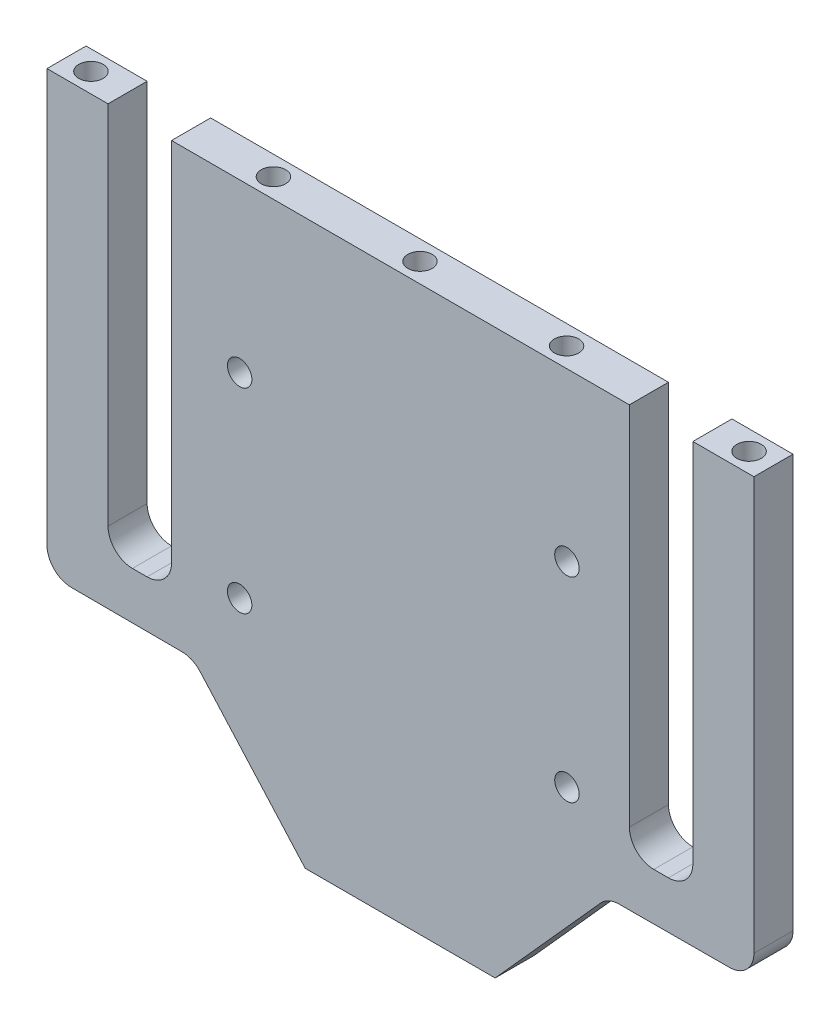
ISO-10303-21;
HEADER;
FILE_DESCRIPTION(('STEP AP214'),'2;1');
FILE_NAME('part.step','',(''),(''),'','','');
FILE_SCHEMA(('AUTOMOTIVE_DESIGN { 1 0 10303 214 1 1 1 1 }'));
ENDSEC;
DATA;
#1=APPLICATION_CONTEXT('core data for automotive mechanical design processes');
#2=APPLICATION_PROTOCOL_DEFINITION('international standard','automotive_design',2000,#1);
#3=PRODUCT_CONTEXT('',#1,'mechanical');
#4=PRODUCT('Part','Part','',(#3));
#5=PRODUCT_RELATED_PRODUCT_CATEGORY('part','',(#4));
#6=PRODUCT_DEFINITION_FORMATION('','',#4);
#7=PRODUCT_DEFINITION_CONTEXT('part definition',#1,'design');
#8=PRODUCT_DEFINITION('design','',#6,#7);
#9=PRODUCT_DEFINITION_SHAPE('','',#8);
#10=(LENGTH_UNIT() NAMED_UNIT(*) SI_UNIT(.MILLI.,.METRE.));
#11=(NAMED_UNIT(*) PLANE_ANGLE_UNIT() SI_UNIT($,.RADIAN.));
#12=(NAMED_UNIT(*) SI_UNIT($,.STERADIAN.) SOLID_ANGLE_UNIT());
#13=UNCERTAINTY_MEASURE_WITH_UNIT(LENGTH_MEASURE(1.E-05),#10,'distance_accuracy_value','');
#14=(GEOMETRIC_REPRESENTATION_CONTEXT(3) GLOBAL_UNCERTAINTY_ASSIGNED_CONTEXT((#13)) GLOBAL_UNIT_ASSIGNED_CONTEXT((#10,
#11,#12)) REPRESENTATION_CONTEXT('',''));
#15=CARTESIAN_POINT('',(0.,0.,0.));
#16=DIRECTION('',(0.,0.,1.));
#17=DIRECTION('',(1.,0.,0.));
#18=AXIS2_PLACEMENT_3D('',#15,#16,#17);
#19=CARTESIAN_POINT('',(142.361429131201,115.359943174136,8.01));
#20=DIRECTION('',(0.,-1.,0.));
#21=DIRECTION('',(0.,0.,-1.));
#22=AXIS2_PLACEMENT_3D('',#19,#20,#21);
#23=PLANE('',#22);
#24=CARTESIAN_POINT('',(137.361429131207,115.359943174136,4.));
#25=DIRECTION('',(0.,-1.,0.));
#26=DIRECTION('',(0.,0.,-1.));
#27=AXIS2_PLACEMENT_3D('',#24,#25,#26);
#28=CIRCLE('',#27,2.5);
#29=CARTESIAN_POINT('',(137.361429131207,115.359943174136,1.50000000000001));
#30=VERTEX_POINT('',#29);
#31=EDGE_CURVE('E942',#30,#30,#28,.T.);
#32=ORIENTED_EDGE('',*,*,#31,.T.);
#33=EDGE_LOOP('',(#32));
#34=FACE_BOUND('',#33,.T.);
#35=DIRECTION('',(1.,0.,0.));
#36=VECTOR('',#35,1.);
#37=CARTESIAN_POINT('',(114.734330831104,115.359943174136,8.));
#38=LINE('',#37,#36);
#39=CARTESIAN_POINT('',(129.861429131214,115.359943174136,8.));
#40=VERTEX_POINT('',#39);
#41=CARTESIAN_POINT('',(142.361429131201,115.359943174136,8.));
#42=VERTEX_POINT('',#41);
#43=EDGE_CURVE('E372',#40,#42,#38,.T.);
#44=ORIENTED_EDGE('',*,*,#43,.T.);
#45=DIRECTION('',(0.,0.,1.));
#46=VECTOR('',#45,1.);
#47=CARTESIAN_POINT('',(142.361429131201,115.359943174136,8.));
#48=LINE('',#47,#46);
#49=CARTESIAN_POINT('',(142.361429131201,115.359943174136,0.));
#50=VERTEX_POINT('',#49);
#51=EDGE_CURVE('E367',#50,#42,#48,.T.);
#52=ORIENTED_EDGE('',*,*,#51,.F.);
#53=DIRECTION('',(1.,0.,0.));
#54=VECTOR('',#53,1.);
#55=CARTESIAN_POINT('',(114.734330831104,115.359943174136,0.));
#56=LINE('',#55,#54);
#57=CARTESIAN_POINT('',(129.861429131214,115.359943174136,0.));
#58=VERTEX_POINT('',#57);
#59=EDGE_CURVE('E369',#58,#50,#56,.T.);
#60=ORIENTED_EDGE('',*,*,#59,.F.);
#61=DIRECTION('',(0.,0.,1.));
#62=VECTOR('',#61,1.);
#63=CARTESIAN_POINT('',(129.861429131214,115.359943174136,8.));
#64=LINE('',#63,#62);
#65=EDGE_CURVE('E43',#58,#40,#64,.T.);
#66=ORIENTED_EDGE('',*,*,#65,.T.);
#67=EDGE_LOOP('',(#44,#52,#60,#66));
#68=FACE_BOUND('',#67,.T.);
#69=ADVANCED_FACE('F39',(#34,#68),#23,.F.);
#70=CARTESIAN_POINT('',(100.,115.359943174136,4.));
#71=DIRECTION('',(0.,1.,0.));
#72=DIRECTION('',(0.,0.,1.));
#73=AXIS2_PLACEMENT_3D('',#70,#71,#72);
#74=CIRCLE('',#73,2.5);
#75=CARTESIAN_POINT('',(100.,115.359943174136,6.5));
#76=VERTEX_POINT('',#75);
#77=EDGE_CURVE('E922',#76,#76,#74,.F.);
#78=ORIENTED_EDGE('',*,*,#77,.T.);
#79=EDGE_LOOP('',(#78));
#80=FACE_BOUND('',#79,.T.);
#81=CARTESIAN_POINT('',(40.,115.359943174136,4.));
#82=DIRECTION('',(0.,-1.,0.));
#83=DIRECTION('',(0.,0.,-1.));
#84=AXIS2_PLACEMENT_3D('',#81,#82,#83);
#85=CIRCLE('',#84,2.5);
#86=CARTESIAN_POINT('',(40.,115.359943174136,1.50000000000001));
#87=VERTEX_POINT('',#86);
#88=EDGE_CURVE('E930',#87,#87,#85,.T.);
#89=ORIENTED_EDGE('',*,*,#88,.T.);
#90=EDGE_LOOP('',(#89));
#91=FACE_BOUND('',#90,.T.);
#92=CARTESIAN_POINT('',(70.,115.359943174136,4.));
#93=DIRECTION('',(0.,-1.,0.));
#94=DIRECTION('',(0.,0.,-1.));
#95=AXIS2_PLACEMENT_3D('',#92,#93,#94);
#96=CIRCLE('',#95,2.5);
#97=CARTESIAN_POINT('',(70.,115.359943174136,1.50000000000001));
#98=VERTEX_POINT('',#97);
#99=EDGE_CURVE('E936',#98,#98,#96,.T.);
#100=ORIENTED_EDGE('',*,*,#99,.T.);
#101=EDGE_LOOP('',(#100));
#102=FACE_BOUND('',#101,.T.);
#103=DIRECTION('',(0.,0.,-1.));
#104=VECTOR('',#103,1.);
#105=CARTESIAN_POINT('',(116.861429131214,115.359943174136,8.));
#106=LINE('',#105,#104);
#107=CARTESIAN_POINT('',(116.861429131214,115.359943174136,8.));
#108=VERTEX_POINT('',#107);
#109=CARTESIAN_POINT('',(116.861429131214,115.359943174136,0.));
#110=VERTEX_POINT('',#109);
#111=EDGE_CURVE('E378',#108,#110,#106,.T.);
#112=ORIENTED_EDGE('',*,*,#111,.T.);
#113=CARTESIAN_POINT('',(23.1385708687968,115.359943174136,0.));
#114=VERTEX_POINT('',#113);
#115=EDGE_CURVE('E371',#114,#110,#56,.T.);
#116=ORIENTED_EDGE('',*,*,#115,.F.);
#117=DIRECTION('',(0.,0.,1.));
#118=VECTOR('',#117,1.);
#119=CARTESIAN_POINT('',(23.1385708687968,115.359943174136,8.));
#120=LINE('',#119,#118);
#121=CARTESIAN_POINT('',(23.1385708687968,115.359943174136,8.));
#122=VERTEX_POINT('',#121);
#123=EDGE_CURVE('E48',#114,#122,#120,.T.);
#124=ORIENTED_EDGE('',*,*,#123,.T.);
#125=EDGE_CURVE('E375',#122,#108,#38,.T.);
#126=ORIENTED_EDGE('',*,*,#125,.T.);
#127=EDGE_LOOP('',(#112,#116,#124,#126));
#128=FACE_BOUND('',#127,.T.);
#129=ADVANCED_FACE('F412',(#80,#91,#102,#128),#23,.F.);
#130=CARTESIAN_POINT('',(2.63857086880265,115.359943174136,4.));
#131=DIRECTION('',(0.,-1.,0.));
#132=DIRECTION('',(0.,0.,-1.));
#133=AXIS2_PLACEMENT_3D('',#130,#131,#132);
#134=CIRCLE('',#133,2.5);
#135=CARTESIAN_POINT('',(2.63857086880265,115.359943174136,1.5));
#136=VERTEX_POINT('',#135);
#137=EDGE_CURVE('E925',#136,#136,#134,.T.);
#138=ORIENTED_EDGE('',*,*,#137,.T.);
#139=EDGE_LOOP('',(#138));
#140=FACE_BOUND('',#139,.T.);
#141=CARTESIAN_POINT('',(-2.3614291311915,115.359943174136,8.));
#142=VERTEX_POINT('',#141);
#143=CARTESIAN_POINT('',(10.1385708687967,115.359943174136,8.));
#144=VERTEX_POINT('',#143);
#145=EDGE_CURVE('E376',#142,#144,#38,.T.);
#146=ORIENTED_EDGE('',*,*,#145,.T.);
#147=DIRECTION('',(0.,0.,-1.));
#148=VECTOR('',#147,1.);
#149=CARTESIAN_POINT('',(10.1385708687967,115.359943174136,8.));
#150=LINE('',#149,#148);
#151=CARTESIAN_POINT('',(10.1385708687967,115.359943174136,0.));
#152=VERTEX_POINT('',#151);
#153=EDGE_CURVE('E11',#144,#152,#150,.T.);
#154=ORIENTED_EDGE('',*,*,#153,.T.);
#155=CARTESIAN_POINT('',(-2.3614291311915,115.359943174136,0.));
#156=VERTEX_POINT('',#155);
#157=EDGE_CURVE('E56',#156,#152,#56,.T.);
#158=ORIENTED_EDGE('',*,*,#157,.F.);
#159=DIRECTION('',(0.,0.,-1.));
#160=VECTOR('',#159,1.);
#161=CARTESIAN_POINT('',(-2.3614291311915,115.359943174136,8.));
#162=LINE('',#161,#160);
#163=EDGE_CURVE('E364',#142,#156,#162,.T.);
#164=ORIENTED_EDGE('',*,*,#163,.F.);
#165=EDGE_LOOP('',(#146,#154,#158,#164));
#166=FACE_BOUND('',#165,.T.);
#167=ADVANCED_FACE('F41',(#140,#166),#23,.F.);
#168=CARTESIAN_POINT('',(114.734330831104,20.7823478267735,8.));
#169=DIRECTION('',(0.,0.,1.));
#170=DIRECTION('',(1.,0.,0.));
#171=AXIS2_PLACEMENT_3D('',#168,#169,#170);
#172=PLANE('',#171);
#173=CARTESIAN_POINT('',(37.0785708687969,41.1924926620058,8.));
#174=DIRECTION('',(0.,0.,1.));
#175=DIRECTION('',(1.,0.,0.));
#176=AXIS2_PLACEMENT_3D('',#173,#174,#175);
#177=CIRCLE('',#176,2.5);
#178=CARTESIAN_POINT('',(39.5785708687969,41.1924926620058,8.));
#179=VERTEX_POINT('',#178);
#180=EDGE_CURVE('E903',#179,#179,#177,.T.);
#181=ORIENTED_EDGE('',*,*,#180,.F.);
#182=EDGE_LOOP('',(#181));
#183=FACE_BOUND('',#182,.T.);
#184=CARTESIAN_POINT('',(104.078570868797,41.1924926620058,8.));
#185=DIRECTION('',(0.,0.,1.));
#186=DIRECTION('',(1.,0.,0.));
#187=AXIS2_PLACEMENT_3D('',#184,#185,#186);
#188=CIRCLE('',#187,2.5);
#189=CARTESIAN_POINT('',(106.578570868797,41.1924926620058,8.));
#190=VERTEX_POINT('',#189);
#191=EDGE_CURVE('E907',#190,#190,#188,.T.);
#192=ORIENTED_EDGE('',*,*,#191,.F.);
#193=EDGE_LOOP('',(#192));
#194=FACE_BOUND('',#193,.T.);
#195=CARTESIAN_POINT('',(104.078570868797,81.1924926620058,8.));
#196=DIRECTION('',(0.,0.,1.));
#197=DIRECTION('',(1.,0.,0.));
#198=AXIS2_PLACEMENT_3D('',#195,#196,#197);
#199=CIRCLE('',#198,2.5);
#200=CARTESIAN_POINT('',(106.578570868797,81.1924926620058,8.));
#201=VERTEX_POINT('',#200);
#202=EDGE_CURVE('E919',#201,#201,#199,.T.);
#203=ORIENTED_EDGE('',*,*,#202,.F.);
#204=EDGE_LOOP('',(#203));
#205=FACE_BOUND('',#204,.T.);
#206=CARTESIAN_POINT('',(37.0785708687969,81.1924926620058,8.));
#207=DIRECTION('',(0.,0.,1.));
#208=DIRECTION('',(1.,0.,0.));
#209=AXIS2_PLACEMENT_3D('',#206,#207,#208);
#210=CIRCLE('',#209,2.5);
#211=CARTESIAN_POINT('',(39.5785708687969,81.1924926620058,8.));
#212=VERTEX_POINT('',#211);
#213=EDGE_CURVE('E916',#212,#212,#210,.T.);
#214=ORIENTED_EDGE('',*,*,#213,.F.);
#215=EDGE_LOOP('',(#214));
#216=FACE_BOUND('',#215,.T.);
#217=ORIENTED_EDGE('',*,*,#145,.F.);
#218=DIRECTION('',(0.,-1.,0.));
#219=VECTOR('',#218,1.);
#220=CARTESIAN_POINT('',(-2.3614291311915,214.274017901078,8.));
#221=LINE('',#220,#219);
#222=CARTESIAN_POINT('',(-2.36142913119149,30.8599431741363,8.));
#223=VERTEX_POINT('',#222);
#224=EDGE_CURVE('E305',#142,#223,#221,.T.);
#225=ORIENTED_EDGE('',*,*,#224,.T.);
#226=CARTESIAN_POINT('',(2.63857086880851,30.8599431741363,8.));
#227=DIRECTION('',(0.,0.,1.));
#228=DIRECTION('',(-1.,0.,0.));
#229=AXIS2_PLACEMENT_3D('',#226,#227,#228);
#230=CIRCLE('',#229,5.);
#231=CARTESIAN_POINT('',(2.63857086880812,25.8599431741363,8.));
#232=VERTEX_POINT('',#231);
#233=EDGE_CURVE('E307',#223,#232,#230,.T.);
#234=ORIENTED_EDGE('',*,*,#233,.T.);
#235=DIRECTION('',(0.999994124417924,-0.00342799206976642,0.));
#236=VECTOR('',#235,1.);
#237=CARTESIAN_POINT('',(25.2828091292453,25.7823184488632,8.));
#238=LINE('',#237,#236);
#239=CARTESIAN_POINT('',(25.2828091292453,25.7823184488632,8.));
#240=VERTEX_POINT('',#239);
#241=EDGE_CURVE('E309',#232,#240,#238,.T.);
#242=ORIENTED_EDGE('',*,*,#241,.T.);
#243=CARTESIAN_POINT('',(25.2656691688965,20.7823478267735,8.));
#244=DIRECTION('',(0.,0.,-1.));
#245=DIRECTION('',(-1.,0.,0.));
#246=AXIS2_PLACEMENT_3D('',#243,#244,#245);
#247=CIRCLE('',#246,5.);
#248=CARTESIAN_POINT('',(28.9972260111802,24.1103327325094,8.));
#249=VERTEX_POINT('',#248);
#250=EDGE_CURVE('E311',#240,#249,#247,.T.);
#251=ORIENTED_EDGE('',*,*,#250,.T.);
#252=DIRECTION('',(0.665596981147171,-0.74631136845674,0.));
#253=VECTOR('',#252,1.);
#254=CARTESIAN_POINT('',(28.9972260111802,24.1103327325094,8.));
#255=LINE('',#254,#253);
#256=CARTESIAN_POINT('',(50.5,0.,8.));
#257=VERTEX_POINT('',#256);
#258=EDGE_CURVE('E288',#249,#257,#255,.T.);
#259=ORIENTED_EDGE('',*,*,#258,.T.);
#260=DIRECTION('',(1.,0.,0.));
#261=VECTOR('',#260,1.);
#262=CARTESIAN_POINT('',(89.3828592898621,0.,8.));
#263=LINE('',#262,#261);
#264=CARTESIAN_POINT('',(89.3828592898621,0.,8.));
#265=VERTEX_POINT('',#264);
#266=EDGE_CURVE('E291',#257,#265,#263,.T.);
#267=ORIENTED_EDGE('',*,*,#266,.T.);
#268=DIRECTION('',(0.667609283497738,0.744511816284763,0.));
#269=VECTOR('',#268,1.);
#270=CARTESIAN_POINT('',(89.3828592898621,0.,8.));
#271=LINE('',#270,#269);
#272=CARTESIAN_POINT('',(111.00277398882,24.1103327325094,8.));
#273=VERTEX_POINT('',#272);
#274=EDGE_CURVE('E294',#265,#273,#271,.T.);
#275=ORIENTED_EDGE('',*,*,#274,.T.);
#276=CARTESIAN_POINT('',(114.734330831104,20.7823478267735,8.));
#277=DIRECTION('',(0.,0.,-1.));
#278=DIRECTION('',(1.,0.,0.));
#279=AXIS2_PLACEMENT_3D('',#276,#277,#278);
#280=CIRCLE('',#279,5.);
#281=CARTESIAN_POINT('',(114.717190870755,25.7823184488632,8.));
#282=VERTEX_POINT('',#281);
#283=EDGE_CURVE('E296',#273,#282,#280,.T.);
#284=ORIENTED_EDGE('',*,*,#283,.T.);
#285=DIRECTION('',(0.999994124417924,0.00342799206976557,0.));
#286=VECTOR('',#285,1.);
#287=CARTESIAN_POINT('',(114.717190870755,25.7823184488632,8.));
#288=LINE('',#287,#286);
#289=CARTESIAN_POINT('',(137.361429131203,25.8599431741363,8.));
#290=VERTEX_POINT('',#289);
#291=EDGE_CURVE('E298',#282,#290,#288,.T.);
#292=ORIENTED_EDGE('',*,*,#291,.T.);
#293=CARTESIAN_POINT('',(137.361429131202,30.8599431741363,8.));
#294=DIRECTION('',(0.,0.,1.));
#295=DIRECTION('',(1.,0.,0.));
#296=AXIS2_PLACEMENT_3D('',#293,#294,#295);
#297=CIRCLE('',#296,4.99999999999935);
#298=CARTESIAN_POINT('',(142.361429131202,30.8599431741363,8.));
#299=VERTEX_POINT('',#298);
#300=EDGE_CURVE('E300',#290,#299,#297,.T.);
#301=ORIENTED_EDGE('',*,*,#300,.T.);
#302=DIRECTION('',(0.,1.,0.));
#303=VECTOR('',#302,1.);
#304=CARTESIAN_POINT('',(142.361429131201,214.274017901078,8.));
#305=LINE('',#304,#303);
#306=EDGE_CURVE('E302',#299,#42,#305,.T.);
#307=ORIENTED_EDGE('',*,*,#306,.T.);
#308=ORIENTED_EDGE('',*,*,#43,.F.);
#309=DIRECTION('',(0.,1.,0.));
#310=VECTOR('',#309,1.);
#311=CARTESIAN_POINT('',(129.861429131214,213.625959477353,8.));
#312=LINE('',#311,#310);
#313=CARTESIAN_POINT('',(129.861429131214,40.4924926620058,8.));
#314=VERTEX_POINT('',#313);
#315=EDGE_CURVE('E260',#314,#40,#312,.T.);
#316=ORIENTED_EDGE('',*,*,#315,.F.);
#317=CARTESIAN_POINT('',(124.861429131214,40.4924926620058,8.));
#318=DIRECTION('',(0.,0.,1.));
#319=DIRECTION('',(1.,0.,0.));
#320=AXIS2_PLACEMENT_3D('',#317,#318,#319);
#321=CIRCLE('',#320,5.);
#322=CARTESIAN_POINT('',(124.861429131214,35.4924926620058,8.));
#323=VERTEX_POINT('',#322);
#324=EDGE_CURVE('E258',#323,#314,#321,.T.);
#325=ORIENTED_EDGE('',*,*,#324,.F.);
#326=DIRECTION('',(1.,0.,0.));
#327=VECTOR('',#326,1.);
#328=CARTESIAN_POINT('',(124.861429131214,35.4924926620058,8.));
#329=LINE('',#328,#327);
#330=CARTESIAN_POINT('',(121.861429131214,35.4924926620058,8.));
#331=VERTEX_POINT('',#330);
#332=EDGE_CURVE('E255',#331,#323,#329,.T.);
#333=ORIENTED_EDGE('',*,*,#332,.F.);
#334=CARTESIAN_POINT('',(121.861429131214,40.4924926620058,8.));
#335=DIRECTION('',(0.,0.,1.));
#336=DIRECTION('',(-1.,0.,0.));
#337=AXIS2_PLACEMENT_3D('',#334,#335,#336);
#338=CIRCLE('',#337,5.);
#339=CARTESIAN_POINT('',(116.861429131214,40.4924926620058,8.));
#340=VERTEX_POINT('',#339);
#341=EDGE_CURVE('E253',#340,#331,#338,.T.);
#342=ORIENTED_EDGE('',*,*,#341,.F.);
#343=DIRECTION('',(0.,-1.,0.));
#344=VECTOR('',#343,1.);
#345=CARTESIAN_POINT('',(116.861429131214,40.4924926620058,8.));
#346=LINE('',#345,#344);
#347=EDGE_CURVE('E263',#108,#340,#346,.T.);
#348=ORIENTED_EDGE('',*,*,#347,.F.);
#349=ORIENTED_EDGE('',*,*,#125,.F.);
#350=DIRECTION('',(0.,1.,0.));
#351=VECTOR('',#350,1.);
#352=CARTESIAN_POINT('',(23.1385708687968,40.4924926620058,8.));
#353=LINE('',#352,#351);
#354=CARTESIAN_POINT('',(23.1385708687968,40.4924926620058,8.));
#355=VERTEX_POINT('',#354);
#356=EDGE_CURVE('E230',#355,#122,#353,.T.);
#357=ORIENTED_EDGE('',*,*,#356,.F.);
#358=CARTESIAN_POINT('',(18.1385708687968,40.4924926620058,8.));
#359=DIRECTION('',(0.,0.,1.));
#360=DIRECTION('',(1.,0.,0.));
#361=AXIS2_PLACEMENT_3D('',#358,#359,#360);
#362=CIRCLE('',#361,5.);
#363=CARTESIAN_POINT('',(18.1385708687968,35.4924926620058,8.));
#364=VERTEX_POINT('',#363);
#365=EDGE_CURVE('E228',#364,#355,#362,.T.);
#366=ORIENTED_EDGE('',*,*,#365,.F.);
#367=DIRECTION('',(1.,0.,0.));
#368=VECTOR('',#367,1.);
#369=CARTESIAN_POINT('',(15.1385708687967,35.4924926620058,8.));
#370=LINE('',#369,#368);
#371=CARTESIAN_POINT('',(15.1385708687967,35.4924926620058,8.));
#372=VERTEX_POINT('',#371);
#373=EDGE_CURVE('E213',#372,#364,#370,.T.);
#374=ORIENTED_EDGE('',*,*,#373,.F.);
#375=CARTESIAN_POINT('',(15.1385708687967,40.4924926620058,8.));
#376=DIRECTION('',(0.,0.,1.));
#377=DIRECTION('',(-1.,0.,0.));
#378=AXIS2_PLACEMENT_3D('',#375,#376,#377);
#379=CIRCLE('',#378,5.);
#380=CARTESIAN_POINT('',(10.1385708687967,40.4924926620058,8.));
#381=VERTEX_POINT('',#380);
#382=EDGE_CURVE('E202',#381,#372,#379,.T.);
#383=ORIENTED_EDGE('',*,*,#382,.F.);
#384=DIRECTION('',(0.,-1.,0.));
#385=VECTOR('',#384,1.);
#386=CARTESIAN_POINT('',(10.1385708687967,213.625959477353,8.));
#387=LINE('',#386,#385);
#388=EDGE_CURVE('E236',#144,#381,#387,.T.);
#389=ORIENTED_EDGE('',*,*,#388,.F.);
#390=EDGE_LOOP('',(#217,#225,#234,#242,#251,#259,#267,#275,#284,#292,#301,#307,#308,#316,#325,
#333,#342,#348,#349,#357,#366,#374,#383,#389));
#391=FACE_BOUND('',#390,.T.);
#392=ADVANCED_FACE('F226',(#183,#194,#205,#216,#391),#172,.T.);
#393=CARTESIAN_POINT('',(114.734330831104,20.7823478267735,0.));
#394=DIRECTION('',(0.,0.,1.));
#395=DIRECTION('',(1.,0.,0.));
#396=AXIS2_PLACEMENT_3D('',#393,#394,#395);
#397=PLANE('',#396);
#398=CARTESIAN_POINT('',(37.0785708687969,41.1924926620058,0.));
#399=DIRECTION('',(0.,0.,1.));
#400=DIRECTION('',(1.,0.,0.));
#401=AXIS2_PLACEMENT_3D('',#398,#399,#400);
#402=CIRCLE('',#401,2.5);
#403=CARTESIAN_POINT('',(39.5785708687969,41.1924926620058,0.));
#404=VERTEX_POINT('',#403);
#405=EDGE_CURVE('E900',#404,#404,#402,.T.);
#406=ORIENTED_EDGE('',*,*,#405,.T.);
#407=EDGE_LOOP('',(#406));
#408=FACE_BOUND('',#407,.T.);
#409=CARTESIAN_POINT('',(104.078570868797,41.1924926620058,0.));
#410=DIRECTION('',(0.,0.,1.));
#411=DIRECTION('',(1.,0.,0.));
#412=AXIS2_PLACEMENT_3D('',#409,#410,#411);
#413=CIRCLE('',#412,2.5);
#414=CARTESIAN_POINT('',(106.578570868797,41.1924926620058,0.));
#415=VERTEX_POINT('',#414);
#416=EDGE_CURVE('E904',#415,#415,#413,.T.);
#417=ORIENTED_EDGE('',*,*,#416,.T.);
#418=EDGE_LOOP('',(#417));
#419=FACE_BOUND('',#418,.T.);
#420=CARTESIAN_POINT('',(104.078570868797,81.1924926620058,0.));
#421=DIRECTION('',(0.,0.,1.));
#422=DIRECTION('',(1.,0.,0.));
#423=AXIS2_PLACEMENT_3D('',#420,#421,#422);
#424=CIRCLE('',#423,2.5);
#425=CARTESIAN_POINT('',(106.578570868797,81.1924926620058,0.));
#426=VERTEX_POINT('',#425);
#427=EDGE_CURVE('E964',#426,#426,#424,.T.);
#428=ORIENTED_EDGE('',*,*,#427,.T.);
#429=EDGE_LOOP('',(#428));
#430=FACE_BOUND('',#429,.T.);
#431=CARTESIAN_POINT('',(37.0785708687969,81.1924926620058,0.));
#432=DIRECTION('',(0.,0.,1.));
#433=DIRECTION('',(1.,0.,0.));
#434=AXIS2_PLACEMENT_3D('',#431,#432,#433);
#435=CIRCLE('',#434,2.5);
#436=CARTESIAN_POINT('',(39.5785708687969,81.1924926620058,0.));
#437=VERTEX_POINT('',#436);
#438=EDGE_CURVE('E912',#437,#437,#435,.T.);
#439=ORIENTED_EDGE('',*,*,#438,.T.);
#440=EDGE_LOOP('',(#439));
#441=FACE_BOUND('',#440,.T.);
#442=DIRECTION('',(0.,-1.,0.));
#443=VECTOR('',#442,1.);
#444=CARTESIAN_POINT('',(-2.3614291311915,214.274017901078,0.));
#445=LINE('',#444,#443);
#446=CARTESIAN_POINT('',(-2.36142913119149,30.8599431741363,0.));
#447=VERTEX_POINT('',#446);
#448=EDGE_CURVE('E329',#156,#447,#445,.T.);
#449=ORIENTED_EDGE('',*,*,#448,.F.);
#450=ORIENTED_EDGE('',*,*,#157,.T.);
#451=DIRECTION('',(0.,-1.,0.));
#452=VECTOR('',#451,1.);
#453=CARTESIAN_POINT('',(10.1385708687967,213.625959477353,0.));
#454=LINE('',#453,#452);
#455=CARTESIAN_POINT('',(10.1385708687967,40.4924926620058,0.));
#456=VERTEX_POINT('',#455);
#457=EDGE_CURVE('E214',#152,#456,#454,.T.);
#458=ORIENTED_EDGE('',*,*,#457,.T.);
#459=CARTESIAN_POINT('',(15.1385708687967,40.4924926620058,0.));
#460=DIRECTION('',(0.,0.,1.));
#461=DIRECTION('',(-1.,0.,0.));
#462=AXIS2_PLACEMENT_3D('',#459,#460,#461);
#463=CIRCLE('',#462,5.);
#464=CARTESIAN_POINT('',(15.1385708687967,35.4924926620058,0.));
#465=VERTEX_POINT('',#464);
#466=EDGE_CURVE('E238',#456,#465,#463,.T.);
#467=ORIENTED_EDGE('',*,*,#466,.T.);
#468=DIRECTION('',(1.,0.,0.));
#469=VECTOR('',#468,1.);
#470=CARTESIAN_POINT('',(15.1385708687967,35.4924926620058,0.));
#471=LINE('',#470,#469);
#472=CARTESIAN_POINT('',(18.1385708687968,35.4924926620058,0.));
#473=VERTEX_POINT('',#472);
#474=EDGE_CURVE('E220',#465,#473,#471,.T.);
#475=ORIENTED_EDGE('',*,*,#474,.T.);
#476=CARTESIAN_POINT('',(18.1385708687968,40.4924926620058,0.));
#477=DIRECTION('',(0.,0.,1.));
#478=DIRECTION('',(1.,0.,0.));
#479=AXIS2_PLACEMENT_3D('',#476,#477,#478);
#480=CIRCLE('',#479,5.);
#481=CARTESIAN_POINT('',(23.1385708687968,40.4924926620058,0.));
#482=VERTEX_POINT('',#481);
#483=EDGE_CURVE('E242',#473,#482,#480,.T.);
#484=ORIENTED_EDGE('',*,*,#483,.T.);
#485=DIRECTION('',(0.,1.,0.));
#486=VECTOR('',#485,1.);
#487=CARTESIAN_POINT('',(23.1385708687968,40.4924926620058,0.));
#488=LINE('',#487,#486);
#489=EDGE_CURVE('E245',#482,#114,#488,.T.);
#490=ORIENTED_EDGE('',*,*,#489,.T.);
#491=ORIENTED_EDGE('',*,*,#115,.T.);
#492=DIRECTION('',(0.,-1.,0.));
#493=VECTOR('',#492,1.);
#494=CARTESIAN_POINT('',(116.861429131214,40.4924926620058,0.));
#495=LINE('',#494,#493);
#496=CARTESIAN_POINT('',(116.861429131214,40.4924926620058,0.));
#497=VERTEX_POINT('',#496);
#498=EDGE_CURVE('E256',#110,#497,#495,.T.);
#499=ORIENTED_EDGE('',*,*,#498,.T.);
#500=CARTESIAN_POINT('',(121.861429131214,40.4924926620058,0.));
#501=DIRECTION('',(0.,0.,1.));
#502=DIRECTION('',(-1.,0.,0.));
#503=AXIS2_PLACEMENT_3D('',#500,#501,#502);
#504=CIRCLE('',#503,5.);
#505=CARTESIAN_POINT('',(121.861429131214,35.4924926620058,0.));
#506=VERTEX_POINT('',#505);
#507=EDGE_CURVE('E221',#497,#506,#504,.T.);
#508=ORIENTED_EDGE('',*,*,#507,.T.);
#509=DIRECTION('',(1.,0.,0.));
#510=VECTOR('',#509,1.);
#511=CARTESIAN_POINT('',(124.861429131214,35.4924926620058,0.));
#512=LINE('',#511,#510);
#513=CARTESIAN_POINT('',(124.861429131214,35.4924926620058,0.));
#514=VERTEX_POINT('',#513);
#515=EDGE_CURVE('E268',#506,#514,#512,.T.);
#516=ORIENTED_EDGE('',*,*,#515,.T.);
#517=CARTESIAN_POINT('',(124.861429131214,40.4924926620058,0.));
#518=DIRECTION('',(0.,0.,1.));
#519=DIRECTION('',(1.,0.,0.));
#520=AXIS2_PLACEMENT_3D('',#517,#518,#519);
#521=CIRCLE('',#520,5.);
#522=CARTESIAN_POINT('',(129.861429131214,40.4924926620058,0.));
#523=VERTEX_POINT('',#522);
#524=EDGE_CURVE('E271',#514,#523,#521,.T.);
#525=ORIENTED_EDGE('',*,*,#524,.T.);
#526=DIRECTION('',(0.,1.,0.));
#527=VECTOR('',#526,1.);
#528=CARTESIAN_POINT('',(129.861429131214,213.625959477353,0.));
#529=LINE('',#528,#527);
#530=EDGE_CURVE('E274',#523,#58,#529,.T.);
#531=ORIENTED_EDGE('',*,*,#530,.T.);
#532=ORIENTED_EDGE('',*,*,#59,.T.);
#533=DIRECTION('',(0.,1.,0.));
#534=VECTOR('',#533,1.);
#535=CARTESIAN_POINT('',(142.361429131201,214.274017901078,0.));
#536=LINE('',#535,#534);
#537=CARTESIAN_POINT('',(142.361429131202,30.8599431741363,0.));
#538=VERTEX_POINT('',#537);
#539=EDGE_CURVE('E326',#538,#50,#536,.T.);
#540=ORIENTED_EDGE('',*,*,#539,.F.);
#541=CARTESIAN_POINT('',(137.361429131202,30.8599431741363,0.));
#542=DIRECTION('',(0.,0.,1.));
#543=DIRECTION('',(1.,0.,0.));
#544=AXIS2_PLACEMENT_3D('',#541,#542,#543);
#545=CIRCLE('',#544,4.99999999999935);
#546=CARTESIAN_POINT('',(137.361429131203,25.8599431741363,0.));
#547=VERTEX_POINT('',#546);
#548=EDGE_CURVE('E324',#547,#538,#545,.T.);
#549=ORIENTED_EDGE('',*,*,#548,.F.);
#550=DIRECTION('',(0.999994124417924,0.00342799206976557,0.));
#551=VECTOR('',#550,1.);
#552=CARTESIAN_POINT('',(114.717190870755,25.7823184488632,0.));
#553=LINE('',#552,#551);
#554=CARTESIAN_POINT('',(114.717190870755,25.7823184488632,0.));
#555=VERTEX_POINT('',#554);
#556=EDGE_CURVE('E322',#555,#547,#553,.T.);
#557=ORIENTED_EDGE('',*,*,#556,.F.);
#558=CARTESIAN_POINT('',(114.734330831104,20.7823478267735,0.));
#559=DIRECTION('',(0.,0.,-1.));
#560=DIRECTION('',(1.,0.,0.));
#561=AXIS2_PLACEMENT_3D('',#558,#559,#560);
#562=CIRCLE('',#561,5.);
#563=CARTESIAN_POINT('',(111.00277398882,24.1103327325094,0.));
#564=VERTEX_POINT('',#563);
#565=EDGE_CURVE('E320',#564,#555,#562,.T.);
#566=ORIENTED_EDGE('',*,*,#565,.F.);
#567=DIRECTION('',(0.667609283497738,0.744511816284763,0.));
#568=VECTOR('',#567,1.);
#569=CARTESIAN_POINT('',(89.3828592898621,0.,0.));
#570=LINE('',#569,#568);
#571=CARTESIAN_POINT('',(89.3828592898621,0.,0.));
#572=VERTEX_POINT('',#571);
#573=EDGE_CURVE('E318',#572,#564,#570,.T.);
#574=ORIENTED_EDGE('',*,*,#573,.F.);
#575=DIRECTION('',(1.,0.,0.));
#576=VECTOR('',#575,1.);
#577=CARTESIAN_POINT('',(89.3828592898621,0.,0.));
#578=LINE('',#577,#576);
#579=CARTESIAN_POINT('',(50.5,0.,0.));
#580=VERTEX_POINT('',#579);
#581=EDGE_CURVE('E316',#580,#572,#578,.T.);
#582=ORIENTED_EDGE('',*,*,#581,.F.);
#583=DIRECTION('',(0.665596981147171,-0.74631136845674,0.));
#584=VECTOR('',#583,1.);
#585=CARTESIAN_POINT('',(28.9972260111802,24.1103327325094,0.));
#586=LINE('',#585,#584);
#587=CARTESIAN_POINT('',(28.9972260111802,24.1103327325094,0.));
#588=VERTEX_POINT('',#587);
#589=EDGE_CURVE('E287',#588,#580,#586,.T.);
#590=ORIENTED_EDGE('',*,*,#589,.F.);
#591=CARTESIAN_POINT('',(25.2656691688965,20.7823478267735,0.));
#592=DIRECTION('',(0.,0.,-1.));
#593=DIRECTION('',(-1.,0.,0.));
#594=AXIS2_PLACEMENT_3D('',#591,#592,#593);
#595=CIRCLE('',#594,5.);
#596=CARTESIAN_POINT('',(25.2828091292453,25.7823184488632,0.));
#597=VERTEX_POINT('',#596);
#598=EDGE_CURVE('E292',#597,#588,#595,.T.);
#599=ORIENTED_EDGE('',*,*,#598,.F.);
#600=DIRECTION('',(0.999994124417924,-0.00342799206976642,0.));
#601=VECTOR('',#600,1.);
#602=CARTESIAN_POINT('',(25.2828091292453,25.7823184488632,0.));
#603=LINE('',#602,#601);
#604=CARTESIAN_POINT('',(2.63857086880812,25.8599431741363,0.));
#605=VERTEX_POINT('',#604);
#606=EDGE_CURVE('E333',#605,#597,#603,.T.);
#607=ORIENTED_EDGE('',*,*,#606,.F.);
#608=CARTESIAN_POINT('',(2.63857086880851,30.8599431741363,0.));
#609=DIRECTION('',(0.,0.,1.));
#610=DIRECTION('',(-1.,0.,0.));
#611=AXIS2_PLACEMENT_3D('',#608,#609,#610);
#612=CIRCLE('',#611,5.);
#613=EDGE_CURVE('E331',#447,#605,#612,.T.);
#614=ORIENTED_EDGE('',*,*,#613,.F.);
#615=EDGE_LOOP('',(#449,#450,#458,#467,#475,#484,#490,#491,#499,#508,#516,#525,#531,#532,#540,
#549,#557,#566,#574,#582,#590,#599,#607,#614));
#616=FACE_BOUND('',#615,.T.);
#617=ADVANCED_FACE('F409',(#408,#419,#430,#441,#616),#397,.F.);
#618=CARTESIAN_POINT('',(28.9972260111802,24.1103327325094,8.));
#619=DIRECTION('',(0.74631136845674,0.665596981147171,0.));
#620=DIRECTION('',(-0.665596981147171,0.74631136845674,0.));
#621=AXIS2_PLACEMENT_3D('',#618,#619,#620);
#622=PLANE('',#621);
#623=ORIENTED_EDGE('',*,*,#589,.T.);
#624=DIRECTION('',(0.,0.,-1.));
#625=VECTOR('',#624,1.);
#626=CARTESIAN_POINT('',(50.5,0.,8.));
#627=LINE('',#626,#625);
#628=EDGE_CURVE('E362',#257,#580,#627,.T.);
#629=ORIENTED_EDGE('',*,*,#628,.F.);
#630=ORIENTED_EDGE('',*,*,#258,.F.);
#631=DIRECTION('',(0.,0.,-1.));
#632=VECTOR('',#631,1.);
#633=CARTESIAN_POINT('',(28.9972260111802,24.1103327325094,8.));
#634=LINE('',#633,#632);
#635=EDGE_CURVE('E313',#249,#588,#634,.T.);
#636=ORIENTED_EDGE('',*,*,#635,.T.);
#637=EDGE_LOOP('',(#623,#629,#630,#636));
#638=FACE_BOUND('',#637,.T.);
#639=ADVANCED_FACE('F445',(#638),#622,.F.);
#640=CARTESIAN_POINT('',(89.3828592898621,0.,8.));
#641=DIRECTION('',(0.,1.,0.));
#642=DIRECTION('',(0.,0.,1.));
#643=AXIS2_PLACEMENT_3D('',#640,#641,#642);
#644=PLANE('',#643);
#645=ORIENTED_EDGE('',*,*,#581,.T.);
#646=DIRECTION('',(0.,0.,-1.));
#647=VECTOR('',#646,1.);
#648=CARTESIAN_POINT('',(89.3828592898621,0.,8.));
#649=LINE('',#648,#647);
#650=EDGE_CURVE('E359',#265,#572,#649,.T.);
#651=ORIENTED_EDGE('',*,*,#650,.F.);
#652=ORIENTED_EDGE('',*,*,#266,.F.);
#653=ORIENTED_EDGE('',*,*,#628,.T.);
#654=EDGE_LOOP('',(#645,#651,#652,#653));
#655=FACE_BOUND('',#654,.T.);
#656=ADVANCED_FACE('F450',(#655),#644,.F.);
#657=CARTESIAN_POINT('',(89.3828592898621,0.,8.));
#658=DIRECTION('',(-0.744511816284763,0.667609283497738,0.));
#659=DIRECTION('',(-0.667609283497738,-0.744511816284763,0.));
#660=AXIS2_PLACEMENT_3D('',#657,#658,#659);
#661=PLANE('',#660);
#662=ORIENTED_EDGE('',*,*,#573,.T.);
#663=DIRECTION('',(0.,0.,-1.));
#664=VECTOR('',#663,1.);
#665=CARTESIAN_POINT('',(111.00277398882,24.1103327325094,8.));
#666=LINE('',#665,#664);
#667=EDGE_CURVE('E356',#273,#564,#666,.T.);
#668=ORIENTED_EDGE('',*,*,#667,.F.);
#669=ORIENTED_EDGE('',*,*,#274,.F.);
#670=ORIENTED_EDGE('',*,*,#650,.T.);
#671=EDGE_LOOP('',(#662,#668,#669,#670));
#672=FACE_BOUND('',#671,.T.);
#673=ADVANCED_FACE('F453',(#672),#661,.F.);
#674=CARTESIAN_POINT('',(114.734330831104,20.7823478267735,8.));
#675=DIRECTION('',(0.,0.,-1.));
#676=DIRECTION('',(-1.,0.,0.));
#677=AXIS2_PLACEMENT_3D('',#674,#675,#676);
#678=CYLINDRICAL_SURFACE('',#677,5.);
#679=ORIENTED_EDGE('',*,*,#565,.T.);
#680=DIRECTION('',(0.,0.,-1.));
#681=VECTOR('',#680,1.);
#682=CARTESIAN_POINT('',(114.717190870755,25.7823184488632,8.));
#683=LINE('',#682,#681);
#684=EDGE_CURVE('E353',#282,#555,#683,.T.);
#685=ORIENTED_EDGE('',*,*,#684,.F.);
#686=ORIENTED_EDGE('',*,*,#283,.F.);
#687=ORIENTED_EDGE('',*,*,#667,.T.);
#688=EDGE_LOOP('',(#679,#685,#686,#687));
#689=FACE_BOUND('',#688,.T.);
#690=ADVANCED_FACE('F458',(#689),#678,.F.);
#691=CARTESIAN_POINT('',(114.717190870755,25.7823184488632,8.));
#692=DIRECTION('',(-0.00342799206976556,0.999994124417924,0.));
#693=DIRECTION('',(-0.999994124417924,-0.00342799206976556,0.));
#694=AXIS2_PLACEMENT_3D('',#691,#692,#693);
#695=PLANE('',#694);
#696=ORIENTED_EDGE('',*,*,#556,.T.);
#697=DIRECTION('',(0.,0.,-1.));
#698=VECTOR('',#697,1.);
#699=CARTESIAN_POINT('',(137.361429131203,25.8599431741363,8.));
#700=LINE('',#699,#698);
#701=EDGE_CURVE('E350',#290,#547,#700,.T.);
#702=ORIENTED_EDGE('',*,*,#701,.F.);
#703=ORIENTED_EDGE('',*,*,#291,.F.);
#704=ORIENTED_EDGE('',*,*,#684,.T.);
#705=EDGE_LOOP('',(#696,#702,#703,#704));
#706=FACE_BOUND('',#705,.T.);
#707=ADVANCED_FACE('F464',(#706),#695,.F.);
#708=CARTESIAN_POINT('',(137.361429131202,30.8599431741363,8.));
#709=DIRECTION('',(0.,0.,-1.));
#710=DIRECTION('',(-1.,0.,0.));
#711=AXIS2_PLACEMENT_3D('',#708,#709,#710);
#712=CYLINDRICAL_SURFACE('',#711,4.99999999999935);
#713=ORIENTED_EDGE('',*,*,#548,.T.);
#714=DIRECTION('',(0.,0.,-1.));
#715=VECTOR('',#714,1.);
#716=CARTESIAN_POINT('',(142.361429131202,30.8599431741363,8.));
#717=LINE('',#716,#715);
#718=EDGE_CURVE('E347',#299,#538,#717,.T.);
#719=ORIENTED_EDGE('',*,*,#718,.F.);
#720=ORIENTED_EDGE('',*,*,#300,.F.);
#721=ORIENTED_EDGE('',*,*,#701,.T.);
#722=EDGE_LOOP('',(#713,#719,#720,#721));
#723=FACE_BOUND('',#722,.T.);
#724=ADVANCED_FACE('F468',(#723),#712,.T.);
#725=CARTESIAN_POINT('',(142.361429131201,214.274017901078,8.));
#726=DIRECTION('',(-1.,0.,0.));
#727=DIRECTION('',(0.,-1.,0.));
#728=AXIS2_PLACEMENT_3D('',#725,#726,#727);
#729=PLANE('',#728);
#730=ORIENTED_EDGE('',*,*,#539,.T.);
#731=ORIENTED_EDGE('',*,*,#51,.T.);
#732=ORIENTED_EDGE('',*,*,#306,.F.);
#733=ORIENTED_EDGE('',*,*,#718,.T.);
#734=EDGE_LOOP('',(#730,#731,#732,#733));
#735=FACE_BOUND('',#734,.T.);
#736=ADVANCED_FACE('F471',(#735),#729,.F.);
#737=CARTESIAN_POINT('',(-2.3614291311915,214.274017901078,8.));
#738=DIRECTION('',(1.,0.,0.));
#739=DIRECTION('',(0.,1.,0.));
#740=AXIS2_PLACEMENT_3D('',#737,#738,#739);
#741=PLANE('',#740);
#742=ORIENTED_EDGE('',*,*,#224,.F.);
#743=ORIENTED_EDGE('',*,*,#163,.T.);
#744=ORIENTED_EDGE('',*,*,#448,.T.);
#745=DIRECTION('',(0.,0.,-1.));
#746=VECTOR('',#745,1.);
#747=CARTESIAN_POINT('',(-2.36142913119149,30.8599431741363,8.));
#748=LINE('',#747,#746);
#749=EDGE_CURVE('E344',#223,#447,#748,.T.);
#750=ORIENTED_EDGE('',*,*,#749,.F.);
#751=EDGE_LOOP('',(#742,#743,#744,#750));
#752=FACE_BOUND('',#751,.T.);
#753=ADVANCED_FACE('F425',(#752),#741,.F.);
#754=CARTESIAN_POINT('',(2.63857086880851,30.8599431741363,8.));
#755=DIRECTION('',(0.,0.,-1.));
#756=DIRECTION('',(-1.,0.,0.));
#757=AXIS2_PLACEMENT_3D('',#754,#755,#756);
#758=CYLINDRICAL_SURFACE('',#757,5.);
#759=ORIENTED_EDGE('',*,*,#613,.T.);
#760=DIRECTION('',(0.,0.,-1.));
#761=VECTOR('',#760,1.);
#762=CARTESIAN_POINT('',(2.63857086880812,25.8599431741363,8.));
#763=LINE('',#762,#761);
#764=EDGE_CURVE('E341',#232,#605,#763,.T.);
#765=ORIENTED_EDGE('',*,*,#764,.F.);
#766=ORIENTED_EDGE('',*,*,#233,.F.);
#767=ORIENTED_EDGE('',*,*,#749,.T.);
#768=EDGE_LOOP('',(#759,#765,#766,#767));
#769=FACE_BOUND('',#768,.T.);
#770=ADVANCED_FACE('F430',(#769),#758,.T.);
#771=CARTESIAN_POINT('',(25.2828091292453,25.7823184488632,8.));
#772=DIRECTION('',(0.00342799206976642,0.999994124417924,0.));
#773=DIRECTION('',(-0.999994124417924,0.00342799206976642,0.));
#774=AXIS2_PLACEMENT_3D('',#771,#772,#773);
#775=PLANE('',#774);
#776=ORIENTED_EDGE('',*,*,#606,.T.);
#777=DIRECTION('',(0.,0.,-1.));
#778=VECTOR('',#777,1.);
#779=CARTESIAN_POINT('',(25.2828091292453,25.7823184488632,8.));
#780=LINE('',#779,#778);
#781=EDGE_CURVE('E338',#240,#597,#780,.T.);
#782=ORIENTED_EDGE('',*,*,#781,.F.);
#783=ORIENTED_EDGE('',*,*,#241,.F.);
#784=ORIENTED_EDGE('',*,*,#764,.T.);
#785=EDGE_LOOP('',(#776,#782,#783,#784));
#786=FACE_BOUND('',#785,.T.);
#787=ADVANCED_FACE('F436',(#786),#775,.F.);
#788=CARTESIAN_POINT('',(25.2656691688965,20.7823478267735,8.));
#789=DIRECTION('',(0.,0.,-1.));
#790=DIRECTION('',(-1.,0.,0.));
#791=AXIS2_PLACEMENT_3D('',#788,#789,#790);
#792=CYLINDRICAL_SURFACE('',#791,5.);
#793=ORIENTED_EDGE('',*,*,#598,.T.);
#794=ORIENTED_EDGE('',*,*,#635,.F.);
#795=ORIENTED_EDGE('',*,*,#250,.F.);
#796=ORIENTED_EDGE('',*,*,#781,.T.);
#797=EDGE_LOOP('',(#793,#794,#795,#796));
#798=FACE_BOUND('',#797,.T.);
#799=ADVANCED_FACE('F440',(#798),#792,.F.);
#800=CARTESIAN_POINT('',(121.861429131214,40.4924926620058,8.));
#801=DIRECTION('',(0.,0.,-1.));
#802=DIRECTION('',(-1.,0.,0.));
#803=AXIS2_PLACEMENT_3D('',#800,#801,#802);
#804=CYLINDRICAL_SURFACE('',#803,5.);
#805=ORIENTED_EDGE('',*,*,#507,.F.);
#806=DIRECTION('',(0.,0.,-1.));
#807=VECTOR('',#806,1.);
#808=CARTESIAN_POINT('',(116.861429131214,40.4924926620058,8.));
#809=LINE('',#808,#807);
#810=EDGE_CURVE('E265',#340,#497,#809,.T.);
#811=ORIENTED_EDGE('',*,*,#810,.F.);
#812=ORIENTED_EDGE('',*,*,#341,.T.);
#813=DIRECTION('',(0.,0.,-1.));
#814=VECTOR('',#813,1.);
#815=CARTESIAN_POINT('',(121.861429131214,35.4924926620058,8.));
#816=LINE('',#815,#814);
#817=EDGE_CURVE('E284',#331,#506,#816,.T.);
#818=ORIENTED_EDGE('',*,*,#817,.T.);
#819=EDGE_LOOP('',(#805,#811,#812,#818));
#820=FACE_BOUND('',#819,.T.);
#821=ADVANCED_FACE('F407',(#820),#804,.F.);
#822=CARTESIAN_POINT('',(124.861429131214,35.4924926620058,8.));
#823=DIRECTION('',(0.,1.,0.));
#824=DIRECTION('',(0.,0.,1.));
#825=AXIS2_PLACEMENT_3D('',#822,#823,#824);
#826=PLANE('',#825);
#827=ORIENTED_EDGE('',*,*,#515,.F.);
#828=ORIENTED_EDGE('',*,*,#817,.F.);
#829=ORIENTED_EDGE('',*,*,#332,.T.);
#830=DIRECTION('',(0.,0.,-1.));
#831=VECTOR('',#830,1.);
#832=CARTESIAN_POINT('',(124.861429131214,35.4924926620058,8.));
#833=LINE('',#832,#831);
#834=EDGE_CURVE('E282',#323,#514,#833,.T.);
#835=ORIENTED_EDGE('',*,*,#834,.T.);
#836=EDGE_LOOP('',(#827,#828,#829,#835));
#837=FACE_BOUND('',#836,.T.);
#838=ADVANCED_FACE('F404',(#837),#826,.T.);
#839=CARTESIAN_POINT('',(124.861429131214,40.4924926620058,8.));
#840=DIRECTION('',(0.,0.,-1.));
#841=DIRECTION('',(-1.,0.,0.));
#842=AXIS2_PLACEMENT_3D('',#839,#840,#841);
#843=CYLINDRICAL_SURFACE('',#842,5.);
#844=ORIENTED_EDGE('',*,*,#524,.F.);
#845=ORIENTED_EDGE('',*,*,#834,.F.);
#846=ORIENTED_EDGE('',*,*,#324,.T.);
#847=DIRECTION('',(0.,0.,-1.));
#848=VECTOR('',#847,1.);
#849=CARTESIAN_POINT('',(129.861429131214,40.4924926620058,8.));
#850=LINE('',#849,#848);
#851=EDGE_CURVE('E280',#314,#523,#850,.T.);
#852=ORIENTED_EDGE('',*,*,#851,.T.);
#853=EDGE_LOOP('',(#844,#845,#846,#852));
#854=FACE_BOUND('',#853,.T.);
#855=ADVANCED_FACE('F397',(#854),#843,.F.);
#856=CARTESIAN_POINT('',(129.861429131214,213.625959477353,8.));
#857=DIRECTION('',(-1.,0.,0.));
#858=DIRECTION('',(0.,0.,1.));
#859=AXIS2_PLACEMENT_3D('',#856,#857,#858);
#860=PLANE('',#859);
#861=ORIENTED_EDGE('',*,*,#65,.F.);
#862=ORIENTED_EDGE('',*,*,#530,.F.);
#863=ORIENTED_EDGE('',*,*,#851,.F.);
#864=ORIENTED_EDGE('',*,*,#315,.T.);
#865=EDGE_LOOP('',(#861,#862,#863,#864));
#866=FACE_BOUND('',#865,.T.);
#867=ADVANCED_FACE('F394',(#866),#860,.T.);
#868=CARTESIAN_POINT('',(116.861429131214,40.4924926620058,8.));
#869=DIRECTION('',(1.,0.,0.));
#870=DIRECTION('',(0.,0.,-1.));
#871=AXIS2_PLACEMENT_3D('',#868,#869,#870);
#872=PLANE('',#871);
#873=ORIENTED_EDGE('',*,*,#111,.F.);
#874=ORIENTED_EDGE('',*,*,#347,.T.);
#875=ORIENTED_EDGE('',*,*,#810,.T.);
#876=ORIENTED_EDGE('',*,*,#498,.F.);
#877=EDGE_LOOP('',(#873,#874,#875,#876));
#878=FACE_BOUND('',#877,.T.);
#879=ADVANCED_FACE('F411',(#878),#872,.T.);
#880=CARTESIAN_POINT('',(15.1385708687967,40.4924926620058,8.));
#881=DIRECTION('',(0.,0.,-1.));
#882=DIRECTION('',(-1.,0.,0.));
#883=AXIS2_PLACEMENT_3D('',#880,#881,#882);
#884=CYLINDRICAL_SURFACE('',#883,5.);
#885=ORIENTED_EDGE('',*,*,#466,.F.);
#886=DIRECTION('',(0.,0.,-1.));
#887=VECTOR('',#886,1.);
#888=CARTESIAN_POINT('',(10.1385708687967,40.4924926620058,8.));
#889=LINE('',#888,#887);
#890=EDGE_CURVE('E209',#381,#456,#889,.T.);
#891=ORIENTED_EDGE('',*,*,#890,.F.);
#892=ORIENTED_EDGE('',*,*,#382,.T.);
#893=DIRECTION('',(0.,0.,-1.));
#894=VECTOR('',#893,1.);
#895=CARTESIAN_POINT('',(15.1385708687967,35.4924926620058,8.));
#896=LINE('',#895,#894);
#897=EDGE_CURVE('E206',#372,#465,#896,.T.);
#898=ORIENTED_EDGE('',*,*,#897,.T.);
#899=EDGE_LOOP('',(#885,#891,#892,#898));
#900=FACE_BOUND('',#899,.T.);
#901=ADVANCED_FACE('F205',(#900),#884,.F.);
#902=CARTESIAN_POINT('',(15.1385708687967,35.4924926620058,8.));
#903=DIRECTION('',(0.,1.,0.));
#904=DIRECTION('',(0.,0.,1.));
#905=AXIS2_PLACEMENT_3D('',#902,#903,#904);
#906=PLANE('',#905);
#907=ORIENTED_EDGE('',*,*,#474,.F.);
#908=ORIENTED_EDGE('',*,*,#897,.F.);
#909=ORIENTED_EDGE('',*,*,#373,.T.);
#910=DIRECTION('',(0.,0.,-1.));
#911=VECTOR('',#910,1.);
#912=CARTESIAN_POINT('',(18.1385708687968,35.4924926620058,8.));
#913=LINE('',#912,#911);
#914=EDGE_CURVE('E222',#364,#473,#913,.T.);
#915=ORIENTED_EDGE('',*,*,#914,.T.);
#916=EDGE_LOOP('',(#907,#908,#909,#915));
#917=FACE_BOUND('',#916,.T.);
#918=ADVANCED_FACE('F217',(#917),#906,.T.);
#919=CARTESIAN_POINT('',(18.1385708687968,40.4924926620058,8.));
#920=DIRECTION('',(0.,0.,-1.));
#921=DIRECTION('',(-1.,0.,0.));
#922=AXIS2_PLACEMENT_3D('',#919,#920,#921);
#923=CYLINDRICAL_SURFACE('',#922,5.);
#924=ORIENTED_EDGE('',*,*,#483,.F.);
#925=ORIENTED_EDGE('',*,*,#914,.F.);
#926=ORIENTED_EDGE('',*,*,#365,.T.);
#927=DIRECTION('',(0.,0.,-1.));
#928=VECTOR('',#927,1.);
#929=CARTESIAN_POINT('',(23.1385708687968,40.4924926620058,8.));
#930=LINE('',#929,#928);
#931=EDGE_CURVE('E250',#355,#482,#930,.T.);
#932=ORIENTED_EDGE('',*,*,#931,.T.);
#933=EDGE_LOOP('',(#924,#925,#926,#932));
#934=FACE_BOUND('',#933,.T.);
#935=ADVANCED_FACE('F419',(#934),#923,.F.);
#936=CARTESIAN_POINT('',(23.1385708687968,40.4924926620058,8.));
#937=DIRECTION('',(-1.,0.,0.));
#938=DIRECTION('',(0.,-1.,0.));
#939=AXIS2_PLACEMENT_3D('',#936,#937,#938);
#940=PLANE('',#939);
#941=ORIENTED_EDGE('',*,*,#123,.F.);
#942=ORIENTED_EDGE('',*,*,#489,.F.);
#943=ORIENTED_EDGE('',*,*,#931,.F.);
#944=ORIENTED_EDGE('',*,*,#356,.T.);
#945=EDGE_LOOP('',(#941,#942,#943,#944));
#946=FACE_BOUND('',#945,.T.);
#947=ADVANCED_FACE('F416',(#946),#940,.T.);
#948=CARTESIAN_POINT('',(10.1385708687967,213.625959477353,8.));
#949=DIRECTION('',(1.,0.,0.));
#950=DIRECTION('',(0.,0.,-1.));
#951=AXIS2_PLACEMENT_3D('',#948,#949,#950);
#952=PLANE('',#951);
#953=ORIENTED_EDGE('',*,*,#153,.F.);
#954=ORIENTED_EDGE('',*,*,#388,.T.);
#955=ORIENTED_EDGE('',*,*,#890,.T.);
#956=ORIENTED_EDGE('',*,*,#457,.F.);
#957=EDGE_LOOP('',(#953,#954,#955,#956));
#958=FACE_BOUND('',#957,.T.);
#959=ADVANCED_FACE('F420',(#958),#952,.T.);
#960=CARTESIAN_POINT('',(2.63857086880265,105.359943174136,4.));
#961=DIRECTION('',(0.,1.,0.));
#962=DIRECTION('',(0.,0.,1.));
#963=AXIS2_PLACEMENT_3D('',#960,#961,#962);
#964=CYLINDRICAL_SURFACE('',#963,2.5);
#965=CARTESIAN_POINT('',(2.63857086880265,105.359943174136,4.));
#966=DIRECTION('',(0.,-1.,0.));
#967=DIRECTION('',(0.,0.,-1.));
#968=AXIS2_PLACEMENT_3D('',#965,#966,#967);
#969=CIRCLE('',#968,2.5);
#970=CARTESIAN_POINT('',(2.63857086880265,105.359943174136,1.5));
#971=VERTEX_POINT('',#970);
#972=EDGE_CURVE('E927',#971,#971,#969,.T.);
#973=ORIENTED_EDGE('',*,*,#972,.T.);
#974=EDGE_LOOP('',(#973));
#975=FACE_BOUND('',#974,.T.);
#976=ORIENTED_EDGE('',*,*,#137,.F.);
#977=EDGE_LOOP('',(#976));
#978=FACE_BOUND('',#977,.T.);
#979=ADVANCED_FACE('F494',(#975,#978),#964,.F.);
#980=CARTESIAN_POINT('',(2.63857086880265,105.359943174136,4.));
#981=DIRECTION('',(0.,-1.,0.));
#982=DIRECTION('',(0.,0.,-1.));
#983=AXIS2_PLACEMENT_3D('',#980,#981,#982);
#984=PLANE('',#983);
#985=ORIENTED_EDGE('',*,*,#972,.F.);
#986=EDGE_LOOP('',(#985));
#987=FACE_BOUND('',#986,.T.);
#988=ADVANCED_FACE('F502',(#987),#984,.F.);
#989=CARTESIAN_POINT('',(70.,105.359943174136,4.));
#990=DIRECTION('',(0.,1.,0.));
#991=DIRECTION('',(0.,0.,1.));
#992=AXIS2_PLACEMENT_3D('',#989,#990,#991);
#993=CYLINDRICAL_SURFACE('',#992,2.5);
#994=CARTESIAN_POINT('',(70.,105.359943174136,4.));
#995=DIRECTION('',(0.,-1.,0.));
#996=DIRECTION('',(0.,0.,-1.));
#997=AXIS2_PLACEMENT_3D('',#994,#995,#996);
#998=CIRCLE('',#997,2.5);
#999=CARTESIAN_POINT('',(70.,105.359943174136,1.50000000000001));
#1000=VERTEX_POINT('',#999);
#1001=EDGE_CURVE('E939',#1000,#1000,#998,.T.);
#1002=ORIENTED_EDGE('',*,*,#1001,.T.);
#1003=EDGE_LOOP('',(#1002));
#1004=FACE_BOUND('',#1003,.T.);
#1005=ORIENTED_EDGE('',*,*,#99,.F.);
#1006=EDGE_LOOP('',(#1005));
#1007=FACE_BOUND('',#1006,.T.);
#1008=ADVANCED_FACE('F610',(#1004,#1007),#993,.F.);
#1009=CARTESIAN_POINT('',(70.,105.359943174136,4.));
#1010=DIRECTION('',(0.,-1.,0.));
#1011=DIRECTION('',(0.,0.,-1.));
#1012=AXIS2_PLACEMENT_3D('',#1009,#1010,#1011);
#1013=PLANE('',#1012);
#1014=ORIENTED_EDGE('',*,*,#1001,.F.);
#1015=EDGE_LOOP('',(#1014));
#1016=FACE_BOUND('',#1015,.T.);
#1017=ADVANCED_FACE('F622',(#1016),#1013,.F.);
#1018=CARTESIAN_POINT('',(40.,105.359943174136,4.));
#1019=DIRECTION('',(0.,1.,0.));
#1020=DIRECTION('',(0.,0.,1.));
#1021=AXIS2_PLACEMENT_3D('',#1018,#1019,#1020);
#1022=CYLINDRICAL_SURFACE('',#1021,2.5);
#1023=CARTESIAN_POINT('',(40.,105.359943174136,4.));
#1024=DIRECTION('',(0.,-1.,0.));
#1025=DIRECTION('',(0.,0.,-1.));
#1026=AXIS2_PLACEMENT_3D('',#1023,#1024,#1025);
#1027=CIRCLE('',#1026,2.5);
#1028=CARTESIAN_POINT('',(40.,105.359943174136,1.50000000000001));
#1029=VERTEX_POINT('',#1028);
#1030=EDGE_CURVE('E933',#1029,#1029,#1027,.T.);
#1031=ORIENTED_EDGE('',*,*,#1030,.T.);
#1032=EDGE_LOOP('',(#1031));
#1033=FACE_BOUND('',#1032,.T.);
#1034=ORIENTED_EDGE('',*,*,#88,.F.);
#1035=EDGE_LOOP('',(#1034));
#1036=FACE_BOUND('',#1035,.T.);
#1037=ADVANCED_FACE('F633',(#1033,#1036),#1022,.F.);
#1038=CARTESIAN_POINT('',(40.,105.359943174136,4.));
#1039=DIRECTION('',(0.,-1.,0.));
#1040=DIRECTION('',(0.,0.,-1.));
#1041=AXIS2_PLACEMENT_3D('',#1038,#1039,#1040);
#1042=PLANE('',#1041);
#1043=ORIENTED_EDGE('',*,*,#1030,.F.);
#1044=EDGE_LOOP('',(#1043));
#1045=FACE_BOUND('',#1044,.T.);
#1046=ADVANCED_FACE('F644',(#1045),#1042,.F.);
#1047=CARTESIAN_POINT('',(100.,105.359943174136,4.));
#1048=DIRECTION('',(0.,1.,0.));
#1049=DIRECTION('',(0.,0.,1.));
#1050=AXIS2_PLACEMENT_3D('',#1047,#1048,#1049);
#1051=CYLINDRICAL_SURFACE('',#1050,2.5);
#1052=CARTESIAN_POINT('',(100.,105.359943174136,4.));
#1053=DIRECTION('',(0.,1.,0.));
#1054=DIRECTION('',(0.,0.,1.));
#1055=AXIS2_PLACEMENT_3D('',#1052,#1053,#1054);
#1056=CIRCLE('',#1055,2.5);
#1057=CARTESIAN_POINT('',(100.,105.359943174136,6.5));
#1058=VERTEX_POINT('',#1057);
#1059=EDGE_CURVE('E240',#1058,#1058,#1056,.F.);
#1060=ORIENTED_EDGE('',*,*,#1059,.T.);
#1061=EDGE_LOOP('',(#1060));
#1062=FACE_BOUND('',#1061,.T.);
#1063=ORIENTED_EDGE('',*,*,#77,.F.);
#1064=EDGE_LOOP('',(#1063));
#1065=FACE_BOUND('',#1064,.T.);
#1066=ADVANCED_FACE('F655',(#1062,#1065),#1051,.F.);
#1067=CARTESIAN_POINT('',(0.,105.359943174136,0.));
#1068=DIRECTION('',(0.,1.,0.));
#1069=DIRECTION('',(0.,0.,1.));
#1070=AXIS2_PLACEMENT_3D('',#1067,#1068,#1069);
#1071=PLANE('',#1070);
#1072=ORIENTED_EDGE('',*,*,#1059,.F.);
#1073=EDGE_LOOP('',(#1072));
#1074=FACE_BOUND('',#1073,.T.);
#1075=ADVANCED_FACE('F666',(#1074),#1071,.T.);
#1076=CARTESIAN_POINT('',(137.361429131207,105.359943174136,4.));
#1077=DIRECTION('',(0.,1.,0.));
#1078=DIRECTION('',(0.,0.,1.));
#1079=AXIS2_PLACEMENT_3D('',#1076,#1077,#1078);
#1080=CYLINDRICAL_SURFACE('',#1079,2.5);
#1081=CARTESIAN_POINT('',(137.361429131207,105.359943174136,4.));
#1082=DIRECTION('',(0.,-1.,0.));
#1083=DIRECTION('',(0.,0.,-1.));
#1084=AXIS2_PLACEMENT_3D('',#1081,#1082,#1083);
#1085=CIRCLE('',#1084,2.5);
#1086=CARTESIAN_POINT('',(137.361429131207,105.359943174136,1.50000000000001));
#1087=VERTEX_POINT('',#1086);
#1088=EDGE_CURVE('E915',#1087,#1087,#1085,.T.);
#1089=ORIENTED_EDGE('',*,*,#1088,.T.);
#1090=EDGE_LOOP('',(#1089));
#1091=FACE_BOUND('',#1090,.T.);
#1092=ORIENTED_EDGE('',*,*,#31,.F.);
#1093=EDGE_LOOP('',(#1092));
#1094=FACE_BOUND('',#1093,.T.);
#1095=ADVANCED_FACE('F677',(#1091,#1094),#1080,.F.);
#1096=CARTESIAN_POINT('',(137.361429131207,105.359943174136,4.));
#1097=DIRECTION('',(0.,-1.,0.));
#1098=DIRECTION('',(0.,0.,-1.));
#1099=AXIS2_PLACEMENT_3D('',#1096,#1097,#1098);
#1100=PLANE('',#1099);
#1101=ORIENTED_EDGE('',*,*,#1088,.F.);
#1102=EDGE_LOOP('',(#1101));
#1103=FACE_BOUND('',#1102,.T.);
#1104=ADVANCED_FACE('F507',(#1103),#1100,.F.);
#1105=CARTESIAN_POINT('',(37.0785708687969,81.1924926620058,0.));
#1106=DIRECTION('',(0.,0.,1.));
#1107=DIRECTION('',(1.,0.,0.));
#1108=AXIS2_PLACEMENT_3D('',#1105,#1106,#1107);
#1109=CYLINDRICAL_SURFACE('',#1108,2.5);
#1110=ORIENTED_EDGE('',*,*,#438,.F.);
#1111=EDGE_LOOP('',(#1110));
#1112=FACE_BOUND('',#1111,.T.);
#1113=ORIENTED_EDGE('',*,*,#213,.T.);
#1114=EDGE_LOOP('',(#1113));
#1115=FACE_BOUND('',#1114,.T.);
#1116=ADVANCED_FACE('F696',(#1112,#1115),#1109,.F.);
#1117=CARTESIAN_POINT('',(104.078570868797,81.1924926620058,0.));
#1118=DIRECTION('',(0.,0.,1.));
#1119=DIRECTION('',(1.,0.,0.));
#1120=AXIS2_PLACEMENT_3D('',#1117,#1118,#1119);
#1121=CYLINDRICAL_SURFACE('',#1120,2.5);
#1122=ORIENTED_EDGE('',*,*,#427,.F.);
#1123=EDGE_LOOP('',(#1122));
#1124=FACE_BOUND('',#1123,.T.);
#1125=ORIENTED_EDGE('',*,*,#202,.T.);
#1126=EDGE_LOOP('',(#1125));
#1127=FACE_BOUND('',#1126,.T.);
#1128=ADVANCED_FACE('F731',(#1124,#1127),#1121,.F.);
#1129=CARTESIAN_POINT('',(104.078570868797,41.1924926620058,0.));
#1130=DIRECTION('',(0.,0.,1.));
#1131=DIRECTION('',(1.,0.,0.));
#1132=AXIS2_PLACEMENT_3D('',#1129,#1130,#1131);
#1133=CYLINDRICAL_SURFACE('',#1132,2.5);
#1134=ORIENTED_EDGE('',*,*,#416,.F.);
#1135=EDGE_LOOP('',(#1134));
#1136=FACE_BOUND('',#1135,.T.);
#1137=ORIENTED_EDGE('',*,*,#191,.T.);
#1138=EDGE_LOOP('',(#1137));
#1139=FACE_BOUND('',#1138,.T.);
#1140=ADVANCED_FACE('F742',(#1136,#1139),#1133,.F.);
#1141=CARTESIAN_POINT('',(37.0785708687969,41.1924926620058,0.));
#1142=DIRECTION('',(0.,0.,1.));
#1143=DIRECTION('',(1.,0.,0.));
#1144=AXIS2_PLACEMENT_3D('',#1141,#1142,#1143);
#1145=CYLINDRICAL_SURFACE('',#1144,2.5);
#1146=ORIENTED_EDGE('',*,*,#405,.F.);
#1147=EDGE_LOOP('',(#1146));
#1148=FACE_BOUND('',#1147,.T.);
#1149=ORIENTED_EDGE('',*,*,#180,.T.);
#1150=EDGE_LOOP('',(#1149));
#1151=FACE_BOUND('',#1150,.T.);
#1152=ADVANCED_FACE('F753',(#1148,#1151),#1145,.F.);
#1153=CLOSED_SHELL('',(#69,#129,#167,#392,#617,#639,#656,#673,#690,#707,#724,#736,#753,#770,
#787,#799,#821,#838,#855,#867,#879,#901,#918,#935,#947,#959,#979,#988,#1008,#1017,#1037,#1046,
#1066,#1075,#1095,#1104,#1116,#1128,#1140,#1152));
#1154=MANIFOLD_SOLID_BREP('B2',#1153);
#1155=ADVANCED_BREP_SHAPE_REPRESENTATION('',(#18,#1154),#14);
#1156=SHAPE_DEFINITION_REPRESENTATION(#9,#1155);
ENDSEC;
END-ISO-10303-21;
